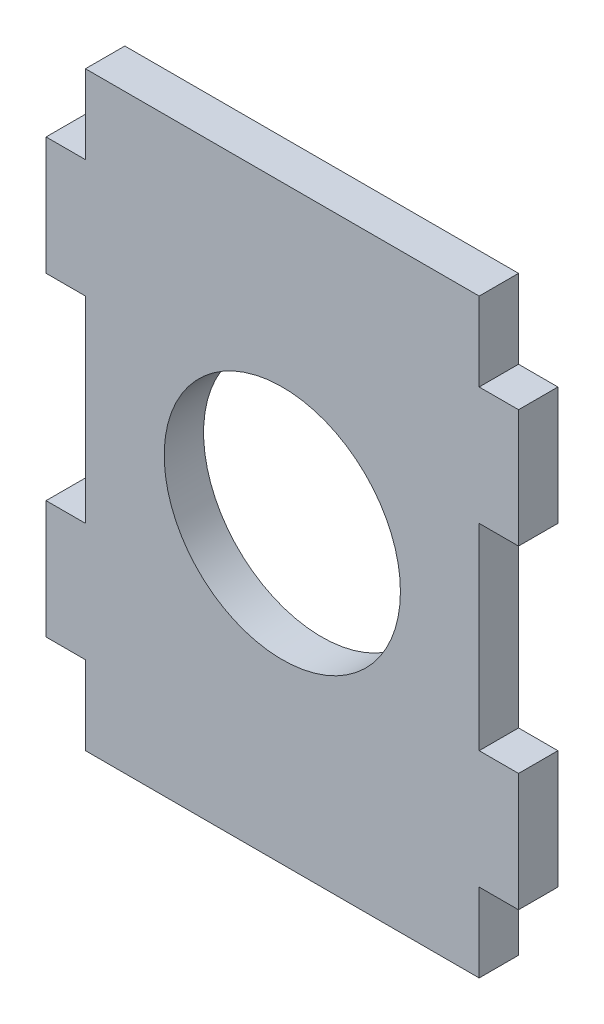
ISO-10303-21;
HEADER;
FILE_DESCRIPTION(('STEP AP214'),'2;1');
FILE_NAME('part.step','',(''),(''),'','','');
FILE_SCHEMA(('AUTOMOTIVE_DESIGN { 1 0 10303 214 1 1 1 1 }'));
ENDSEC;
DATA;
#1=APPLICATION_CONTEXT('core data for automotive mechanical design processes');
#2=APPLICATION_PROTOCOL_DEFINITION('international standard','automotive_design',2000,#1);
#3=PRODUCT_CONTEXT('',#1,'mechanical');
#4=PRODUCT('Part','Part','',(#3));
#5=PRODUCT_RELATED_PRODUCT_CATEGORY('part','',(#4));
#6=PRODUCT_DEFINITION_FORMATION('','',#4);
#7=PRODUCT_DEFINITION_CONTEXT('part definition',#1,'design');
#8=PRODUCT_DEFINITION('design','',#6,#7);
#9=PRODUCT_DEFINITION_SHAPE('','',#8);
#10=(LENGTH_UNIT() NAMED_UNIT(*) SI_UNIT(.MILLI.,.METRE.));
#11=(NAMED_UNIT(*) PLANE_ANGLE_UNIT() SI_UNIT($,.RADIAN.));
#12=(NAMED_UNIT(*) SI_UNIT($,.STERADIAN.) SOLID_ANGLE_UNIT());
#13=UNCERTAINTY_MEASURE_WITH_UNIT(LENGTH_MEASURE(1.E-05),#10,'distance_accuracy_value','');
#14=(GEOMETRIC_REPRESENTATION_CONTEXT(3) GLOBAL_UNCERTAINTY_ASSIGNED_CONTEXT((#13)) GLOBAL_UNIT_ASSIGNED_CONTEXT((#10,
#11,#12)) REPRESENTATION_CONTEXT('',''));
#15=CARTESIAN_POINT('',(0.,0.,0.));
#16=DIRECTION('',(0.,0.,1.));
#17=DIRECTION('',(1.,0.,0.));
#18=AXIS2_PLACEMENT_3D('',#15,#16,#17);
#19=CARTESIAN_POINT('',(-19.05,0.,3.175));
#20=DIRECTION('',(-1.,0.,0.));
#21=DIRECTION('',(0.,-1.,0.));
#22=AXIS2_PLACEMENT_3D('',#19,#20,#21);
#23=PLANE('',#22);
#24=DIRECTION('',(0.,1.,0.));
#25=VECTOR('',#24,1.);
#26=CARTESIAN_POINT('',(-19.05,0.,0.));
#27=LINE('',#26,#25);
#28=CARTESIAN_POINT('',(-19.05,7.9375,0.));
#29=VERTEX_POINT('',#28);
#30=CARTESIAN_POINT('',(-19.05,17.4625,0.));
#31=VERTEX_POINT('',#30);
#32=EDGE_CURVE('E272',#29,#31,#27,.T.);
#33=ORIENTED_EDGE('',*,*,#32,.F.);
#34=DIRECTION('',(0.,0.,-1.));
#35=VECTOR('',#34,1.);
#36=CARTESIAN_POINT('',(-19.05,7.9375,3.175));
#37=LINE('',#36,#35);
#38=CARTESIAN_POINT('',(-19.05,7.9375,3.175));
#39=VERTEX_POINT('',#38);
#40=EDGE_CURVE('E11',#39,#29,#37,.T.);
#41=ORIENTED_EDGE('',*,*,#40,.F.);
#42=DIRECTION('',(0.,1.,0.));
#43=VECTOR('',#42,1.);
#44=CARTESIAN_POINT('',(-19.05,0.,3.175));
#45=LINE('',#44,#43);
#46=CARTESIAN_POINT('',(-19.05,17.4625,3.175));
#47=VERTEX_POINT('',#46);
#48=EDGE_CURVE('E215',#39,#47,#45,.T.);
#49=ORIENTED_EDGE('',*,*,#48,.T.);
#50=DIRECTION('',(0.,0.,-1.));
#51=VECTOR('',#50,1.);
#52=CARTESIAN_POINT('',(-19.05,17.4625,3.175));
#53=LINE('',#52,#51);
#54=EDGE_CURVE('E121',#47,#31,#53,.T.);
#55=ORIENTED_EDGE('',*,*,#54,.T.);
#56=EDGE_LOOP('',(#33,#41,#49,#55));
#57=FACE_BOUND('',#56,.T.);
#58=ADVANCED_FACE('F35',(#57),#23,.T.);
#59=CARTESIAN_POINT('',(0.,7.93750000000001,3.175));
#60=DIRECTION('',(0.,-1.,0.));
#61=DIRECTION('',(1.,0.,0.));
#62=AXIS2_PLACEMENT_3D('',#59,#60,#61);
#63=PLANE('',#62);
#64=DIRECTION('',(-1.,0.,0.));
#65=VECTOR('',#64,1.);
#66=CARTESIAN_POINT('',(0.,7.93750000000001,0.));
#67=LINE('',#66,#65);
#68=CARTESIAN_POINT('',(-15.875,7.9375,0.));
#69=VERTEX_POINT('',#68);
#70=EDGE_CURVE('E268',#69,#29,#67,.T.);
#71=ORIENTED_EDGE('',*,*,#70,.F.);
#72=DIRECTION('',(0.,0.,-1.));
#73=VECTOR('',#72,1.);
#74=CARTESIAN_POINT('',(-15.875,7.9375,3.175));
#75=LINE('',#74,#73);
#76=CARTESIAN_POINT('',(-15.875,7.9375,3.175));
#77=VERTEX_POINT('',#76);
#78=EDGE_CURVE('E43',#77,#69,#75,.T.);
#79=ORIENTED_EDGE('',*,*,#78,.F.);
#80=DIRECTION('',(-1.,0.,0.));
#81=VECTOR('',#80,1.);
#82=CARTESIAN_POINT('',(0.,7.93750000000001,3.175));
#83=LINE('',#82,#81);
#84=EDGE_CURVE('E210',#77,#39,#83,.T.);
#85=ORIENTED_EDGE('',*,*,#84,.T.);
#86=ORIENTED_EDGE('',*,*,#40,.T.);
#87=EDGE_LOOP('',(#71,#79,#85,#86));
#88=FACE_BOUND('',#87,.T.);
#89=ADVANCED_FACE('F269',(#88),#63,.T.);
#90=CARTESIAN_POINT('',(-15.875,0.,3.175));
#91=DIRECTION('',(-1.,0.,0.));
#92=DIRECTION('',(0.,0.,1.));
#93=AXIS2_PLACEMENT_3D('',#90,#91,#92);
#94=PLANE('',#93);
#95=DIRECTION('',(0.,1.,0.));
#96=VECTOR('',#95,1.);
#97=CARTESIAN_POINT('',(-15.875,0.,0.));
#98=LINE('',#97,#96);
#99=CARTESIAN_POINT('',(-15.875,-7.9375,0.));
#100=VERTEX_POINT('',#99);
#101=EDGE_CURVE('E266',#100,#69,#98,.T.);
#102=ORIENTED_EDGE('',*,*,#101,.F.);
#103=DIRECTION('',(0.,0.,-1.));
#104=VECTOR('',#103,1.);
#105=CARTESIAN_POINT('',(-15.875,-7.9375,3.175));
#106=LINE('',#105,#104);
#107=CARTESIAN_POINT('',(-15.875,-7.9375,3.175));
#108=VERTEX_POINT('',#107);
#109=EDGE_CURVE('E261',#108,#100,#106,.T.);
#110=ORIENTED_EDGE('',*,*,#109,.F.);
#111=DIRECTION('',(0.,1.,0.));
#112=VECTOR('',#111,1.);
#113=CARTESIAN_POINT('',(-15.875,0.,3.175));
#114=LINE('',#113,#112);
#115=EDGE_CURVE('E200',#108,#77,#114,.T.);
#116=ORIENTED_EDGE('',*,*,#115,.T.);
#117=ORIENTED_EDGE('',*,*,#78,.T.);
#118=EDGE_LOOP('',(#102,#110,#116,#117));
#119=FACE_BOUND('',#118,.T.);
#120=ADVANCED_FACE('F264',(#119),#94,.T.);
#121=CARTESIAN_POINT('',(0.,-7.93749999999999,3.175));
#122=DIRECTION('',(0.,-1.,0.));
#123=DIRECTION('',(1.,0.,0.));
#124=AXIS2_PLACEMENT_3D('',#121,#122,#123);
#125=PLANE('',#124);
#126=DIRECTION('',(-1.,0.,0.));
#127=VECTOR('',#126,1.);
#128=CARTESIAN_POINT('',(0.,-7.93749999999999,0.));
#129=LINE('',#128,#127);
#130=CARTESIAN_POINT('',(-19.05,-7.93750000000001,0.));
#131=VERTEX_POINT('',#130);
#132=EDGE_CURVE('E278',#100,#131,#129,.T.);
#133=ORIENTED_EDGE('',*,*,#132,.T.);
#134=DIRECTION('',(0.,0.,-1.));
#135=VECTOR('',#134,1.);
#136=CARTESIAN_POINT('',(-19.05,-7.93750000000001,3.175));
#137=LINE('',#136,#135);
#138=CARTESIAN_POINT('',(-19.05,-7.93750000000001,3.175));
#139=VERTEX_POINT('',#138);
#140=EDGE_CURVE('E259',#139,#131,#137,.T.);
#141=ORIENTED_EDGE('',*,*,#140,.F.);
#142=DIRECTION('',(-1.,0.,0.));
#143=VECTOR('',#142,1.);
#144=CARTESIAN_POINT('',(0.,-7.93749999999999,3.175));
#145=LINE('',#144,#143);
#146=EDGE_CURVE('E209',#108,#139,#145,.T.);
#147=ORIENTED_EDGE('',*,*,#146,.F.);
#148=ORIENTED_EDGE('',*,*,#109,.T.);
#149=EDGE_LOOP('',(#133,#141,#147,#148));
#150=FACE_BOUND('',#149,.T.);
#151=ADVANCED_FACE('F352',(#150),#125,.F.);
#152=CARTESIAN_POINT('',(-19.05,0.,3.175));
#153=DIRECTION('',(-1.,0.,0.));
#154=DIRECTION('',(0.,-1.,0.));
#155=AXIS2_PLACEMENT_3D('',#152,#153,#154);
#156=PLANE('',#155);
#157=DIRECTION('',(0.,1.,0.));
#158=VECTOR('',#157,1.);
#159=CARTESIAN_POINT('',(-19.05,0.,0.));
#160=LINE('',#159,#158);
#161=CARTESIAN_POINT('',(-19.05,-17.4625,0.));
#162=VERTEX_POINT('',#161);
#163=EDGE_CURVE('E281',#162,#131,#160,.T.);
#164=ORIENTED_EDGE('',*,*,#163,.F.);
#165=DIRECTION('',(0.,0.,-1.));
#166=VECTOR('',#165,1.);
#167=CARTESIAN_POINT('',(-19.05,-17.4625,3.175));
#168=LINE('',#167,#166);
#169=CARTESIAN_POINT('',(-19.05,-17.4625,3.175));
#170=VERTEX_POINT('',#169);
#171=EDGE_CURVE('E257',#170,#162,#168,.T.);
#172=ORIENTED_EDGE('',*,*,#171,.F.);
#173=DIRECTION('',(0.,1.,0.));
#174=VECTOR('',#173,1.);
#175=CARTESIAN_POINT('',(-19.05,0.,3.175));
#176=LINE('',#175,#174);
#177=EDGE_CURVE('E213',#170,#139,#176,.T.);
#178=ORIENTED_EDGE('',*,*,#177,.T.);
#179=ORIENTED_EDGE('',*,*,#140,.T.);
#180=EDGE_LOOP('',(#164,#172,#178,#179));
#181=FACE_BOUND('',#180,.T.);
#182=ADVANCED_FACE('F358',(#181),#156,.T.);
#183=CARTESIAN_POINT('',(0.,-17.4625,3.175));
#184=DIRECTION('',(0.,-1.,0.));
#185=DIRECTION('',(0.,0.,-1.));
#186=AXIS2_PLACEMENT_3D('',#183,#184,#185);
#187=PLANE('',#186);
#188=DIRECTION('',(-1.,0.,0.));
#189=VECTOR('',#188,1.);
#190=CARTESIAN_POINT('',(0.,-17.4625,0.));
#191=LINE('',#190,#189);
#192=CARTESIAN_POINT('',(-15.875,-17.4625,0.));
#193=VERTEX_POINT('',#192);
#194=EDGE_CURVE('E285',#193,#162,#191,.T.);
#195=ORIENTED_EDGE('',*,*,#194,.F.);
#196=DIRECTION('',(0.,0.,-1.));
#197=VECTOR('',#196,1.);
#198=CARTESIAN_POINT('',(-15.875,-17.4625,3.175));
#199=LINE('',#198,#197);
#200=CARTESIAN_POINT('',(-15.875,-17.4625,3.175));
#201=VERTEX_POINT('',#200);
#202=EDGE_CURVE('E255',#201,#193,#199,.T.);
#203=ORIENTED_EDGE('',*,*,#202,.F.);
#204=DIRECTION('',(-1.,0.,0.));
#205=VECTOR('',#204,1.);
#206=CARTESIAN_POINT('',(0.,-17.4625,3.175));
#207=LINE('',#206,#205);
#208=EDGE_CURVE('E207',#201,#170,#207,.T.);
#209=ORIENTED_EDGE('',*,*,#208,.T.);
#210=ORIENTED_EDGE('',*,*,#171,.T.);
#211=EDGE_LOOP('',(#195,#203,#209,#210));
#212=FACE_BOUND('',#211,.T.);
#213=ADVANCED_FACE('F362',(#212),#187,.T.);
#214=CARTESIAN_POINT('',(-15.875,-23.8125,0.));
#215=VERTEX_POINT('',#214);
#216=EDGE_CURVE('E280',#215,#193,#98,.T.);
#217=ORIENTED_EDGE('',*,*,#216,.F.);
#218=DIRECTION('',(0.,0.,-1.));
#219=VECTOR('',#218,1.);
#220=CARTESIAN_POINT('',(-15.875,-23.8125,3.175));
#221=LINE('',#220,#219);
#222=CARTESIAN_POINT('',(-15.875,-23.8125,3.175));
#223=VERTEX_POINT('',#222);
#224=EDGE_CURVE('E253',#223,#215,#221,.T.);
#225=ORIENTED_EDGE('',*,*,#224,.F.);
#226=EDGE_CURVE('E199',#223,#201,#114,.T.);
#227=ORIENTED_EDGE('',*,*,#226,.T.);
#228=ORIENTED_EDGE('',*,*,#202,.T.);
#229=EDGE_LOOP('',(#217,#225,#227,#228));
#230=FACE_BOUND('',#229,.T.);
#231=ADVANCED_FACE('F354',(#230),#94,.T.);
#232=CARTESIAN_POINT('',(0.,-23.8125,3.175));
#233=DIRECTION('',(0.,-1.,0.));
#234=DIRECTION('',(1.,0.,0.));
#235=AXIS2_PLACEMENT_3D('',#232,#233,#234);
#236=PLANE('',#235);
#237=DIRECTION('',(-1.,0.,0.));
#238=VECTOR('',#237,1.);
#239=CARTESIAN_POINT('',(0.,-23.8125,0.));
#240=LINE('',#239,#238);
#241=CARTESIAN_POINT('',(15.875,-23.8125,0.));
#242=VERTEX_POINT('',#241);
#243=EDGE_CURVE('E284',#242,#215,#240,.T.);
#244=ORIENTED_EDGE('',*,*,#243,.F.);
#245=DIRECTION('',(0.,0.,-1.));
#246=VECTOR('',#245,1.);
#247=CARTESIAN_POINT('',(15.875,-23.8125,3.175));
#248=LINE('',#247,#246);
#249=CARTESIAN_POINT('',(15.875,-23.8125,3.175));
#250=VERTEX_POINT('',#249);
#251=EDGE_CURVE('E251',#250,#242,#248,.T.);
#252=ORIENTED_EDGE('',*,*,#251,.F.);
#253=DIRECTION('',(-1.,0.,0.));
#254=VECTOR('',#253,1.);
#255=CARTESIAN_POINT('',(0.,-23.8125,3.175));
#256=LINE('',#255,#254);
#257=EDGE_CURVE('E206',#250,#223,#256,.T.);
#258=ORIENTED_EDGE('',*,*,#257,.T.);
#259=ORIENTED_EDGE('',*,*,#224,.T.);
#260=EDGE_LOOP('',(#244,#252,#258,#259));
#261=FACE_BOUND('',#260,.T.);
#262=ADVANCED_FACE('F367',(#261),#236,.T.);
#263=CARTESIAN_POINT('',(15.875,0.,3.175));
#264=DIRECTION('',(-1.,0.,0.));
#265=DIRECTION('',(0.,0.,1.));
#266=AXIS2_PLACEMENT_3D('',#263,#264,#265);
#267=PLANE('',#266);
#268=DIRECTION('',(0.,1.,0.));
#269=VECTOR('',#268,1.);
#270=CARTESIAN_POINT('',(15.875,0.,0.));
#271=LINE('',#270,#269);
#272=CARTESIAN_POINT('',(15.875,-17.4625,0.));
#273=VERTEX_POINT('',#272);
#274=EDGE_CURVE('E289',#242,#273,#271,.T.);
#275=ORIENTED_EDGE('',*,*,#274,.T.);
#276=DIRECTION('',(0.,0.,-1.));
#277=VECTOR('',#276,1.);
#278=CARTESIAN_POINT('',(15.875,-17.4625,3.175));
#279=LINE('',#278,#277);
#280=CARTESIAN_POINT('',(15.875,-17.4625,3.175));
#281=VERTEX_POINT('',#280);
#282=EDGE_CURVE('E248',#281,#273,#279,.T.);
#283=ORIENTED_EDGE('',*,*,#282,.F.);
#284=DIRECTION('',(0.,1.,0.));
#285=VECTOR('',#284,1.);
#286=CARTESIAN_POINT('',(15.875,0.,3.175));
#287=LINE('',#286,#285);
#288=EDGE_CURVE('E599',#250,#281,#287,.T.);
#289=ORIENTED_EDGE('',*,*,#288,.F.);
#290=ORIENTED_EDGE('',*,*,#251,.T.);
#291=EDGE_LOOP('',(#275,#283,#289,#290));
#292=FACE_BOUND('',#291,.T.);
#293=ADVANCED_FACE('F370',(#292),#267,.F.);
#294=CARTESIAN_POINT('',(0.,-17.4625,3.175));
#295=DIRECTION('',(0.,1.,0.));
#296=DIRECTION('',(0.,0.,1.));
#297=AXIS2_PLACEMENT_3D('',#294,#295,#296);
#298=PLANE('',#297);
#299=DIRECTION('',(1.,0.,0.));
#300=VECTOR('',#299,1.);
#301=CARTESIAN_POINT('',(0.,-17.4625,0.));
#302=LINE('',#301,#300);
#303=CARTESIAN_POINT('',(19.05,-17.4625,0.));
#304=VERTEX_POINT('',#303);
#305=EDGE_CURVE('E296',#273,#304,#302,.T.);
#306=ORIENTED_EDGE('',*,*,#305,.T.);
#307=DIRECTION('',(0.,0.,-1.));
#308=VECTOR('',#307,1.);
#309=CARTESIAN_POINT('',(19.05,-17.4625,3.175));
#310=LINE('',#309,#308);
#311=CARTESIAN_POINT('',(19.05,-17.4625,3.175));
#312=VERTEX_POINT('',#311);
#313=EDGE_CURVE('E245',#312,#304,#310,.T.);
#314=ORIENTED_EDGE('',*,*,#313,.F.);
#315=DIRECTION('',(1.,0.,0.));
#316=VECTOR('',#315,1.);
#317=CARTESIAN_POINT('',(0.,-17.4625,3.175));
#318=LINE('',#317,#316);
#319=EDGE_CURVE('E601',#281,#312,#318,.T.);
#320=ORIENTED_EDGE('',*,*,#319,.F.);
#321=ORIENTED_EDGE('',*,*,#282,.T.);
#322=EDGE_LOOP('',(#306,#314,#320,#321));
#323=FACE_BOUND('',#322,.T.);
#324=ADVANCED_FACE('F372',(#323),#298,.F.);
#325=CARTESIAN_POINT('',(19.05,0.,3.175));
#326=DIRECTION('',(-1.,0.,0.));
#327=DIRECTION('',(0.,0.,1.));
#328=AXIS2_PLACEMENT_3D('',#325,#326,#327);
#329=PLANE('',#328);
#330=DIRECTION('',(0.,1.,0.));
#331=VECTOR('',#330,1.);
#332=CARTESIAN_POINT('',(19.05,0.,0.));
#333=LINE('',#332,#331);
#334=CARTESIAN_POINT('',(19.05,-7.93749999999999,0.));
#335=VERTEX_POINT('',#334);
#336=EDGE_CURVE('E300',#304,#335,#333,.T.);
#337=ORIENTED_EDGE('',*,*,#336,.T.);
#338=DIRECTION('',(0.,0.,-1.));
#339=VECTOR('',#338,1.);
#340=CARTESIAN_POINT('',(19.05,-7.93749999999999,3.175));
#341=LINE('',#340,#339);
#342=CARTESIAN_POINT('',(19.05,-7.93749999999999,3.175));
#343=VERTEX_POINT('',#342);
#344=EDGE_CURVE('E243',#343,#335,#341,.T.);
#345=ORIENTED_EDGE('',*,*,#344,.F.);
#346=DIRECTION('',(0.,1.,0.));
#347=VECTOR('',#346,1.);
#348=CARTESIAN_POINT('',(19.05,0.,3.175));
#349=LINE('',#348,#347);
#350=EDGE_CURVE('E607',#312,#343,#349,.T.);
#351=ORIENTED_EDGE('',*,*,#350,.F.);
#352=ORIENTED_EDGE('',*,*,#313,.T.);
#353=EDGE_LOOP('',(#337,#345,#351,#352));
#354=FACE_BOUND('',#353,.T.);
#355=ADVANCED_FACE('F375',(#354),#329,.F.);
#356=CARTESIAN_POINT('',(0.,-7.93749999999999,3.175));
#357=DIRECTION('',(0.,1.,0.));
#358=DIRECTION('',(0.,0.,1.));
#359=AXIS2_PLACEMENT_3D('',#356,#357,#358);
#360=PLANE('',#359);
#361=DIRECTION('',(1.,0.,0.));
#362=VECTOR('',#361,1.);
#363=CARTESIAN_POINT('',(0.,-7.93749999999999,0.));
#364=LINE('',#363,#362);
#365=CARTESIAN_POINT('',(15.875,-7.93749999999999,0.));
#366=VERTEX_POINT('',#365);
#367=EDGE_CURVE('E303',#366,#335,#364,.T.);
#368=ORIENTED_EDGE('',*,*,#367,.F.);
#369=DIRECTION('',(0.,0.,-1.));
#370=VECTOR('',#369,1.);
#371=CARTESIAN_POINT('',(15.875,-7.93749999999999,3.175));
#372=LINE('',#371,#370);
#373=CARTESIAN_POINT('',(15.875,-7.93749999999999,3.175));
#374=VERTEX_POINT('',#373);
#375=EDGE_CURVE('E241',#374,#366,#372,.T.);
#376=ORIENTED_EDGE('',*,*,#375,.F.);
#377=DIRECTION('',(1.,0.,0.));
#378=VECTOR('',#377,1.);
#379=CARTESIAN_POINT('',(0.,-7.93749999999999,3.175));
#380=LINE('',#379,#378);
#381=EDGE_CURVE('E608',#374,#343,#380,.T.);
#382=ORIENTED_EDGE('',*,*,#381,.T.);
#383=ORIENTED_EDGE('',*,*,#344,.T.);
#384=EDGE_LOOP('',(#368,#376,#382,#383));
#385=FACE_BOUND('',#384,.T.);
#386=ADVANCED_FACE('F379',(#385),#360,.T.);
#387=CARTESIAN_POINT('',(15.875,7.93750000000001,0.));
#388=VERTEX_POINT('',#387);
#389=EDGE_CURVE('E298',#366,#388,#271,.T.);
#390=ORIENTED_EDGE('',*,*,#389,.T.);
#391=DIRECTION('',(0.,0.,-1.));
#392=VECTOR('',#391,1.);
#393=CARTESIAN_POINT('',(15.875,7.93750000000001,3.175));
#394=LINE('',#393,#392);
#395=CARTESIAN_POINT('',(15.875,7.93750000000001,3.175));
#396=VERTEX_POINT('',#395);
#397=EDGE_CURVE('E238',#396,#388,#394,.T.);
#398=ORIENTED_EDGE('',*,*,#397,.F.);
#399=EDGE_CURVE('E339',#374,#396,#287,.T.);
#400=ORIENTED_EDGE('',*,*,#399,.F.);
#401=ORIENTED_EDGE('',*,*,#375,.T.);
#402=EDGE_LOOP('',(#390,#398,#400,#401));
#403=FACE_BOUND('',#402,.T.);
#404=ADVANCED_FACE('F319',(#403),#267,.F.);
#405=CARTESIAN_POINT('',(0.,7.93750000000001,3.175));
#406=DIRECTION('',(0.,1.,0.));
#407=DIRECTION('',(0.,0.,1.));
#408=AXIS2_PLACEMENT_3D('',#405,#406,#407);
#409=PLANE('',#408);
#410=DIRECTION('',(1.,0.,0.));
#411=VECTOR('',#410,1.);
#412=CARTESIAN_POINT('',(0.,7.93750000000001,0.));
#413=LINE('',#412,#411);
#414=CARTESIAN_POINT('',(19.05,7.93750000000001,0.));
#415=VERTEX_POINT('',#414);
#416=EDGE_CURVE('E306',#388,#415,#413,.T.);
#417=ORIENTED_EDGE('',*,*,#416,.T.);
#418=DIRECTION('',(0.,0.,-1.));
#419=VECTOR('',#418,1.);
#420=CARTESIAN_POINT('',(19.05,7.93750000000001,3.175));
#421=LINE('',#420,#419);
#422=CARTESIAN_POINT('',(19.05,7.93750000000001,3.175));
#423=VERTEX_POINT('',#422);
#424=EDGE_CURVE('E236',#423,#415,#421,.T.);
#425=ORIENTED_EDGE('',*,*,#424,.F.);
#426=DIRECTION('',(1.,0.,0.));
#427=VECTOR('',#426,1.);
#428=CARTESIAN_POINT('',(0.,7.93750000000001,3.175));
#429=LINE('',#428,#427);
#430=EDGE_CURVE('E327',#396,#423,#429,.T.);
#431=ORIENTED_EDGE('',*,*,#430,.F.);
#432=ORIENTED_EDGE('',*,*,#397,.T.);
#433=EDGE_LOOP('',(#417,#425,#431,#432));
#434=FACE_BOUND('',#433,.T.);
#435=ADVANCED_FACE('F325',(#434),#409,.F.);
#436=CARTESIAN_POINT('',(19.05,0.,3.175));
#437=DIRECTION('',(1.,0.,0.));
#438=DIRECTION('',(0.,0.,-1.));
#439=AXIS2_PLACEMENT_3D('',#436,#437,#438);
#440=PLANE('',#439);
#441=DIRECTION('',(0.,-1.,0.));
#442=VECTOR('',#441,1.);
#443=CARTESIAN_POINT('',(19.05,0.,0.));
#444=LINE('',#443,#442);
#445=CARTESIAN_POINT('',(19.05,17.4625,0.));
#446=VERTEX_POINT('',#445);
#447=EDGE_CURVE('E309',#446,#415,#444,.T.);
#448=ORIENTED_EDGE('',*,*,#447,.F.);
#449=DIRECTION('',(0.,0.,-1.));
#450=VECTOR('',#449,1.);
#451=CARTESIAN_POINT('',(19.05,17.4625,3.175));
#452=LINE('',#451,#450);
#453=CARTESIAN_POINT('',(19.05,17.4625,3.175));
#454=VERTEX_POINT('',#453);
#455=EDGE_CURVE('E234',#454,#446,#452,.T.);
#456=ORIENTED_EDGE('',*,*,#455,.F.);
#457=DIRECTION('',(0.,-1.,0.));
#458=VECTOR('',#457,1.);
#459=CARTESIAN_POINT('',(19.05,0.,3.175));
#460=LINE('',#459,#458);
#461=EDGE_CURVE('E334',#454,#423,#460,.T.);
#462=ORIENTED_EDGE('',*,*,#461,.T.);
#463=ORIENTED_EDGE('',*,*,#424,.T.);
#464=EDGE_LOOP('',(#448,#456,#462,#463));
#465=FACE_BOUND('',#464,.T.);
#466=ADVANCED_FACE('F331',(#465),#440,.T.);
#467=CARTESIAN_POINT('',(0.,17.4625,3.175));
#468=DIRECTION('',(0.,1.,0.));
#469=DIRECTION('',(0.,0.,1.));
#470=AXIS2_PLACEMENT_3D('',#467,#468,#469);
#471=PLANE('',#470);
#472=DIRECTION('',(1.,0.,0.));
#473=VECTOR('',#472,1.);
#474=CARTESIAN_POINT('',(0.,17.4625,0.));
#475=LINE('',#474,#473);
#476=CARTESIAN_POINT('',(15.875,17.4625,0.));
#477=VERTEX_POINT('',#476);
#478=EDGE_CURVE('E312',#477,#446,#475,.T.);
#479=ORIENTED_EDGE('',*,*,#478,.F.);
#480=DIRECTION('',(0.,0.,-1.));
#481=VECTOR('',#480,1.);
#482=CARTESIAN_POINT('',(15.875,17.4625,3.175));
#483=LINE('',#482,#481);
#484=CARTESIAN_POINT('',(15.875,17.4625,3.175));
#485=VERTEX_POINT('',#484);
#486=EDGE_CURVE('E232',#485,#477,#483,.T.);
#487=ORIENTED_EDGE('',*,*,#486,.F.);
#488=DIRECTION('',(1.,0.,0.));
#489=VECTOR('',#488,1.);
#490=CARTESIAN_POINT('',(0.,17.4625,3.175));
#491=LINE('',#490,#489);
#492=EDGE_CURVE('E336',#485,#454,#491,.T.);
#493=ORIENTED_EDGE('',*,*,#492,.T.);
#494=ORIENTED_EDGE('',*,*,#455,.T.);
#495=EDGE_LOOP('',(#479,#487,#493,#494));
#496=FACE_BOUND('',#495,.T.);
#497=ADVANCED_FACE('F388',(#496),#471,.T.);
#498=CARTESIAN_POINT('',(15.875,23.8125,0.));
#499=VERTEX_POINT('',#498);
#500=EDGE_CURVE('E297',#477,#499,#271,.T.);
#501=ORIENTED_EDGE('',*,*,#500,.T.);
#502=DIRECTION('',(0.,0.,-1.));
#503=VECTOR('',#502,1.);
#504=CARTESIAN_POINT('',(15.875,23.8125,3.175));
#505=LINE('',#504,#503);
#506=CARTESIAN_POINT('',(15.875,23.8125,3.175));
#507=VERTEX_POINT('',#506);
#508=EDGE_CURVE('E195',#507,#499,#505,.T.);
#509=ORIENTED_EDGE('',*,*,#508,.F.);
#510=EDGE_CURVE('E182',#485,#507,#287,.T.);
#511=ORIENTED_EDGE('',*,*,#510,.F.);
#512=ORIENTED_EDGE('',*,*,#486,.T.);
#513=EDGE_LOOP('',(#501,#509,#511,#512));
#514=FACE_BOUND('',#513,.T.);
#515=ADVANCED_FACE('F391',(#514),#267,.F.);
#516=CARTESIAN_POINT('',(0.,23.8125,3.175));
#517=DIRECTION('',(0.,-1.,0.));
#518=DIRECTION('',(1.,0.,0.));
#519=AXIS2_PLACEMENT_3D('',#516,#517,#518);
#520=PLANE('',#519);
#521=DIRECTION('',(-1.,0.,0.));
#522=VECTOR('',#521,1.);
#523=CARTESIAN_POINT('',(0.,23.8125,0.));
#524=LINE('',#523,#522);
#525=CARTESIAN_POINT('',(-15.875,23.8125,0.));
#526=VERTEX_POINT('',#525);
#527=EDGE_CURVE('E191',#499,#526,#524,.T.);
#528=ORIENTED_EDGE('',*,*,#527,.T.);
#529=DIRECTION('',(0.,0.,-1.));
#530=VECTOR('',#529,1.);
#531=CARTESIAN_POINT('',(-15.875,23.8125,3.175));
#532=LINE('',#531,#530);
#533=CARTESIAN_POINT('',(-15.875,23.8125,3.175));
#534=VERTEX_POINT('',#533);
#535=EDGE_CURVE('E188',#534,#526,#532,.T.);
#536=ORIENTED_EDGE('',*,*,#535,.F.);
#537=DIRECTION('',(-1.,0.,0.));
#538=VECTOR('',#537,1.);
#539=CARTESIAN_POINT('',(0.,23.8125,3.175));
#540=LINE('',#539,#538);
#541=EDGE_CURVE('E174',#507,#534,#540,.T.);
#542=ORIENTED_EDGE('',*,*,#541,.F.);
#543=ORIENTED_EDGE('',*,*,#508,.T.);
#544=EDGE_LOOP('',(#528,#536,#542,#543));
#545=FACE_BOUND('',#544,.T.);
#546=ADVANCED_FACE('F189',(#545),#520,.F.);
#547=CARTESIAN_POINT('',(-15.875,17.4625,0.));
#548=VERTEX_POINT('',#547);
#549=EDGE_CURVE('E225',#548,#526,#98,.T.);
#550=ORIENTED_EDGE('',*,*,#549,.F.);
#551=DIRECTION('',(0.,0.,-1.));
#552=VECTOR('',#551,1.);
#553=CARTESIAN_POINT('',(-15.875,17.4625,3.175));
#554=LINE('',#553,#552);
#555=CARTESIAN_POINT('',(-15.875,17.4625,3.175));
#556=VERTEX_POINT('',#555);
#557=EDGE_CURVE('E114',#556,#548,#554,.T.);
#558=ORIENTED_EDGE('',*,*,#557,.F.);
#559=EDGE_CURVE('E179',#556,#534,#114,.T.);
#560=ORIENTED_EDGE('',*,*,#559,.T.);
#561=ORIENTED_EDGE('',*,*,#535,.T.);
#562=EDGE_LOOP('',(#550,#558,#560,#561));
#563=FACE_BOUND('',#562,.T.);
#564=ADVANCED_FACE('F197',(#563),#94,.T.);
#565=CARTESIAN_POINT('',(0.,17.4625,3.175));
#566=DIRECTION('',(0.,-1.,0.));
#567=DIRECTION('',(1.,0.,0.));
#568=AXIS2_PLACEMENT_3D('',#565,#566,#567);
#569=PLANE('',#568);
#570=DIRECTION('',(-1.,0.,0.));
#571=VECTOR('',#570,1.);
#572=CARTESIAN_POINT('',(0.,17.4625,0.));
#573=LINE('',#572,#571);
#574=EDGE_CURVE('E221',#548,#31,#573,.T.);
#575=ORIENTED_EDGE('',*,*,#574,.T.);
#576=ORIENTED_EDGE('',*,*,#54,.F.);
#577=DIRECTION('',(-1.,0.,0.));
#578=VECTOR('',#577,1.);
#579=CARTESIAN_POINT('',(0.,17.4625,3.175));
#580=LINE('',#579,#578);
#581=EDGE_CURVE('E51',#556,#47,#580,.T.);
#582=ORIENTED_EDGE('',*,*,#581,.F.);
#583=ORIENTED_EDGE('',*,*,#557,.T.);
#584=EDGE_LOOP('',(#575,#576,#582,#583));
#585=FACE_BOUND('',#584,.T.);
#586=ADVANCED_FACE('F398',(#585),#569,.F.);
#587=CARTESIAN_POINT('',(0.,0.,3.175));
#588=DIRECTION('',(0.,0.,-1.));
#589=DIRECTION('',(-1.,0.,0.));
#590=AXIS2_PLACEMENT_3D('',#587,#588,#589);
#591=CYLINDRICAL_SURFACE('',#590,9.525);
#592=CARTESIAN_POINT('',(0.,0.,3.175));
#593=DIRECTION('',(0.,0.,1.));
#594=DIRECTION('',(1.,0.,0.));
#595=AXIS2_PLACEMENT_3D('',#592,#593,#594);
#596=CIRCLE('',#595,9.525);
#597=CARTESIAN_POINT('',(9.525,0.,3.175));
#598=VERTEX_POINT('',#597);
#599=EDGE_CURVE('E201',#598,#598,#596,.T.);
#600=ORIENTED_EDGE('',*,*,#599,.T.);
#601=EDGE_LOOP('',(#600));
#602=FACE_BOUND('',#601,.T.);
#603=CARTESIAN_POINT('',(0.,0.,0.));
#604=DIRECTION('',(0.,0.,1.));
#605=DIRECTION('',(1.,0.,0.));
#606=AXIS2_PLACEMENT_3D('',#603,#604,#605);
#607=CIRCLE('',#606,9.525);
#608=CARTESIAN_POINT('',(9.525,0.,0.));
#609=VERTEX_POINT('',#608);
#610=EDGE_CURVE('E218',#609,#609,#607,.T.);
#611=ORIENTED_EDGE('',*,*,#610,.F.);
#612=EDGE_LOOP('',(#611));
#613=FACE_BOUND('',#612,.T.);
#614=ADVANCED_FACE('F401',(#602,#613),#591,.F.);
#615=CARTESIAN_POINT('',(0.,0.,3.175));
#616=DIRECTION('',(0.,0.,1.));
#617=DIRECTION('',(1.,0.,0.));
#618=AXIS2_PLACEMENT_3D('',#615,#616,#617);
#619=PLANE('',#618);
#620=ORIENTED_EDGE('',*,*,#48,.F.);
#621=ORIENTED_EDGE('',*,*,#84,.F.);
#622=ORIENTED_EDGE('',*,*,#115,.F.);
#623=ORIENTED_EDGE('',*,*,#146,.T.);
#624=ORIENTED_EDGE('',*,*,#177,.F.);
#625=ORIENTED_EDGE('',*,*,#208,.F.);
#626=ORIENTED_EDGE('',*,*,#226,.F.);
#627=ORIENTED_EDGE('',*,*,#257,.F.);
#628=ORIENTED_EDGE('',*,*,#288,.T.);
#629=ORIENTED_EDGE('',*,*,#319,.T.);
#630=ORIENTED_EDGE('',*,*,#350,.T.);
#631=ORIENTED_EDGE('',*,*,#381,.F.);
#632=ORIENTED_EDGE('',*,*,#399,.T.);
#633=ORIENTED_EDGE('',*,*,#430,.T.);
#634=ORIENTED_EDGE('',*,*,#461,.F.);
#635=ORIENTED_EDGE('',*,*,#492,.F.);
#636=ORIENTED_EDGE('',*,*,#510,.T.);
#637=ORIENTED_EDGE('',*,*,#541,.T.);
#638=ORIENTED_EDGE('',*,*,#559,.F.);
#639=ORIENTED_EDGE('',*,*,#581,.T.);
#640=EDGE_LOOP('',(#620,#621,#622,#623,#624,#625,#626,#627,#628,#629,#630,#631,#632,#633,#634,
#635,#636,#637,#638,#639));
#641=FACE_BOUND('',#640,.T.);
#642=ORIENTED_EDGE('',*,*,#599,.F.);
#643=EDGE_LOOP('',(#642));
#644=FACE_BOUND('',#643,.T.);
#645=ADVANCED_FACE('F176',(#641,#644),#619,.T.);
#646=CARTESIAN_POINT('',(0.,0.,0.));
#647=DIRECTION('',(0.,0.,1.));
#648=DIRECTION('',(1.,0.,0.));
#649=AXIS2_PLACEMENT_3D('',#646,#647,#648);
#650=PLANE('',#649);
#651=ORIENTED_EDGE('',*,*,#32,.T.);
#652=ORIENTED_EDGE('',*,*,#574,.F.);
#653=ORIENTED_EDGE('',*,*,#549,.T.);
#654=ORIENTED_EDGE('',*,*,#527,.F.);
#655=ORIENTED_EDGE('',*,*,#500,.F.);
#656=ORIENTED_EDGE('',*,*,#478,.T.);
#657=ORIENTED_EDGE('',*,*,#447,.T.);
#658=ORIENTED_EDGE('',*,*,#416,.F.);
#659=ORIENTED_EDGE('',*,*,#389,.F.);
#660=ORIENTED_EDGE('',*,*,#367,.T.);
#661=ORIENTED_EDGE('',*,*,#336,.F.);
#662=ORIENTED_EDGE('',*,*,#305,.F.);
#663=ORIENTED_EDGE('',*,*,#274,.F.);
#664=ORIENTED_EDGE('',*,*,#243,.T.);
#665=ORIENTED_EDGE('',*,*,#216,.T.);
#666=ORIENTED_EDGE('',*,*,#194,.T.);
#667=ORIENTED_EDGE('',*,*,#163,.T.);
#668=ORIENTED_EDGE('',*,*,#132,.F.);
#669=ORIENTED_EDGE('',*,*,#101,.T.);
#670=ORIENTED_EDGE('',*,*,#70,.T.);
#671=EDGE_LOOP('',(#651,#652,#653,#654,#655,#656,#657,#658,#659,#660,#661,#662,#663,#664,#665,
#666,#667,#668,#669,#670));
#672=FACE_BOUND('',#671,.T.);
#673=ORIENTED_EDGE('',*,*,#610,.T.);
#674=EDGE_LOOP('',(#673));
#675=FACE_BOUND('',#674,.T.);
#676=ADVANCED_FACE('F275',(#672,#675),#650,.F.);
#677=CLOSED_SHELL('',(#58,#89,#120,#151,#182,#213,#231,#262,#293,#324,#355,#386,#404,#435,#466,
#497,#515,#546,#564,#586,#614,#645,#676));
#678=MANIFOLD_SOLID_BREP('B2',#677);
#679=ADVANCED_BREP_SHAPE_REPRESENTATION('',(#18,#678),#14);
#680=SHAPE_DEFINITION_REPRESENTATION(#9,#679);
ENDSEC;
END-ISO-10303-21;
